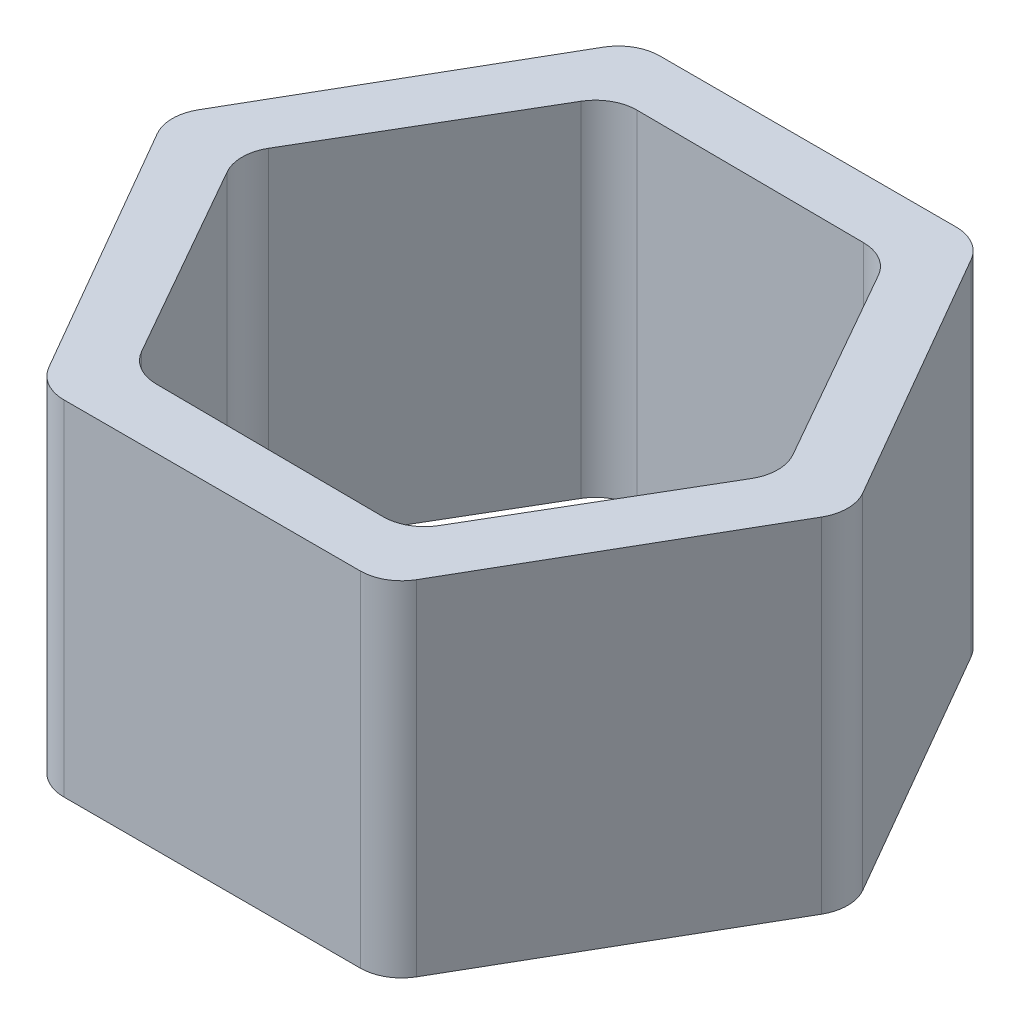
ISO-10303-21;
HEADER;
FILE_DESCRIPTION(('STEP AP214'),'2;1');
FILE_NAME('part.step','',(''),(''),'','','');
FILE_SCHEMA(('AUTOMOTIVE_DESIGN { 1 0 10303 214 1 1 1 1 }'));
ENDSEC;
DATA;
#1=APPLICATION_CONTEXT('core data for automotive mechanical design processes');
#2=APPLICATION_PROTOCOL_DEFINITION('international standard','automotive_design',2000,#1);
#3=PRODUCT_CONTEXT('',#1,'mechanical');
#4=PRODUCT('Part','Part','',(#3));
#5=PRODUCT_RELATED_PRODUCT_CATEGORY('part','',(#4));
#6=PRODUCT_DEFINITION_FORMATION('','',#4);
#7=PRODUCT_DEFINITION_CONTEXT('part definition',#1,'design');
#8=PRODUCT_DEFINITION('design','',#6,#7);
#9=PRODUCT_DEFINITION_SHAPE('','',#8);
#10=(LENGTH_UNIT() NAMED_UNIT(*) SI_UNIT(.MILLI.,.METRE.));
#11=(NAMED_UNIT(*) PLANE_ANGLE_UNIT() SI_UNIT($,.RADIAN.));
#12=(NAMED_UNIT(*) SI_UNIT($,.STERADIAN.) SOLID_ANGLE_UNIT());
#13=UNCERTAINTY_MEASURE_WITH_UNIT(LENGTH_MEASURE(1.E-05),#10,'distance_accuracy_value','');
#14=(GEOMETRIC_REPRESENTATION_CONTEXT(3) GLOBAL_UNCERTAINTY_ASSIGNED_CONTEXT((#13)) GLOBAL_UNIT_ASSIGNED_CONTEXT((#10,
#11,#12)) REPRESENTATION_CONTEXT('',''));
#15=CARTESIAN_POINT('',(0.,0.,0.));
#16=DIRECTION('',(0.,0.,1.));
#17=DIRECTION('',(1.,0.,0.));
#18=AXIS2_PLACEMENT_3D('',#15,#16,#17);
#19=CARTESIAN_POINT('',(-100.,100.,0.));
#20=DIRECTION('',(0.866025403784439,0.,-0.5));
#21=DIRECTION('',(-0.5,0.,-0.866025403784439));
#22=AXIS2_PLACEMENT_3D('',#19,#20,#21);
#23=PLANE('',#22);
#24=DIRECTION('',(0.5,0.,0.866025403784439));
#25=VECTOR('',#24,1.);
#26=CARTESIAN_POINT('',(-100.,100.,0.));
#27=LINE('',#26,#25);
#28=CARTESIAN_POINT('',(-96.5358983848623,100.,6.00000000000002));
#29=VERTEX_POINT('',#28);
#30=CARTESIAN_POINT('',(-53.4641016151378,100.,80.6025403784439));
#31=VERTEX_POINT('',#30);
#32=EDGE_CURVE('E220',#29,#31,#27,.T.);
#33=ORIENTED_EDGE('',*,*,#32,.F.);
#34=DIRECTION('',(0.,-1.,0.));
#35=VECTOR('',#34,1.);
#36=CARTESIAN_POINT('',(-96.5358983848623,100.,6.00000000000002));
#37=LINE('',#36,#35);
#38=CARTESIAN_POINT('',(-96.5358983848623,0.,6.00000000000002));
#39=VERTEX_POINT('',#38);
#40=EDGE_CURVE('E205',#29,#39,#37,.T.);
#41=ORIENTED_EDGE('',*,*,#40,.T.);
#42=DIRECTION('',(0.5,0.,0.866025403784439));
#43=VECTOR('',#42,1.);
#44=CARTESIAN_POINT('',(-100.,0.,0.));
#45=LINE('',#44,#43);
#46=CARTESIAN_POINT('',(-53.4641016151378,0.,80.6025403784439));
#47=VERTEX_POINT('',#46);
#48=EDGE_CURVE('E217',#39,#47,#45,.T.);
#49=ORIENTED_EDGE('',*,*,#48,.T.);
#50=DIRECTION('',(0.,-1.,0.));
#51=VECTOR('',#50,1.);
#52=CARTESIAN_POINT('',(-53.4641016151378,100.,80.6025403784439));
#53=LINE('',#52,#51);
#54=EDGE_CURVE('E222',#47,#31,#53,.F.);
#55=ORIENTED_EDGE('',*,*,#54,.T.);
#56=EDGE_LOOP('',(#33,#41,#49,#55));
#57=FACE_BOUND('',#56,.T.);
#58=ADVANCED_FACE('F39',(#57),#23,.F.);
#59=CARTESIAN_POINT('',(-50.,100.,86.6025403784439));
#60=DIRECTION('',(0.,0.,-1.));
#61=DIRECTION('',(-1.,0.,0.));
#62=AXIS2_PLACEMENT_3D('',#59,#60,#61);
#63=PLANE('',#62);
#64=DIRECTION('',(1.,0.,0.));
#65=VECTOR('',#64,1.);
#66=CARTESIAN_POINT('',(-50.,100.,86.6025403784439));
#67=LINE('',#66,#65);
#68=CARTESIAN_POINT('',(-43.0717967697245,100.,86.6025403784439));
#69=VERTEX_POINT('',#68);
#70=CARTESIAN_POINT('',(43.0717967697244,100.,86.6025403784439));
#71=VERTEX_POINT('',#70);
#72=EDGE_CURVE('E395',#69,#71,#67,.T.);
#73=ORIENTED_EDGE('',*,*,#72,.F.);
#74=DIRECTION('',(0.,-1.,0.));
#75=VECTOR('',#74,1.);
#76=CARTESIAN_POINT('',(-43.0717967697245,100.,86.6025403784439));
#77=LINE('',#76,#75);
#78=CARTESIAN_POINT('',(-43.0717967697245,0.,86.6025403784439));
#79=VERTEX_POINT('',#78);
#80=EDGE_CURVE('E275',#69,#79,#77,.T.);
#81=ORIENTED_EDGE('',*,*,#80,.T.);
#82=DIRECTION('',(1.,0.,0.));
#83=VECTOR('',#82,1.);
#84=CARTESIAN_POINT('',(-50.,0.,86.6025403784439));
#85=LINE('',#84,#83);
#86=CARTESIAN_POINT('',(43.0717967697244,0.,86.6025403784439));
#87=VERTEX_POINT('',#86);
#88=EDGE_CURVE('E226',#79,#87,#85,.T.);
#89=ORIENTED_EDGE('',*,*,#88,.T.);
#90=DIRECTION('',(0.,-1.,0.));
#91=VECTOR('',#90,1.);
#92=CARTESIAN_POINT('',(43.0717967697244,100.,86.6025403784439));
#93=LINE('',#92,#91);
#94=EDGE_CURVE('E273',#87,#71,#93,.F.);
#95=ORIENTED_EDGE('',*,*,#94,.T.);
#96=EDGE_LOOP('',(#73,#81,#89,#95));
#97=FACE_BOUND('',#96,.T.);
#98=ADVANCED_FACE('F443',(#97),#63,.F.);
#99=CARTESIAN_POINT('',(49.9999999999999,100.,86.6025403784439));
#100=DIRECTION('',(-0.866025403784439,0.,-0.5));
#101=DIRECTION('',(-0.5,0.,0.866025403784439));
#102=AXIS2_PLACEMENT_3D('',#99,#100,#101);
#103=PLANE('',#102);
#104=DIRECTION('',(0.5,0.,-0.866025403784439));
#105=VECTOR('',#104,1.);
#106=CARTESIAN_POINT('',(49.9999999999999,100.,86.6025403784439));
#107=LINE('',#106,#105);
#108=CARTESIAN_POINT('',(53.4641016151377,100.,80.6025403784439));
#109=VERTEX_POINT('',#108);
#110=CARTESIAN_POINT('',(96.5358983848622,100.,5.99999999999996));
#111=VERTEX_POINT('',#110);
#112=EDGE_CURVE('E398',#109,#111,#107,.T.);
#113=ORIENTED_EDGE('',*,*,#112,.F.);
#114=DIRECTION('',(0.,-1.,0.));
#115=VECTOR('',#114,1.);
#116=CARTESIAN_POINT('',(53.4641016151377,100.,80.6025403784439));
#117=LINE('',#116,#115);
#118=CARTESIAN_POINT('',(53.4641016151377,0.,80.6025403784439));
#119=VERTEX_POINT('',#118);
#120=EDGE_CURVE('E280',#109,#119,#117,.T.);
#121=ORIENTED_EDGE('',*,*,#120,.T.);
#122=DIRECTION('',(0.5,0.,-0.866025403784439));
#123=VECTOR('',#122,1.);
#124=CARTESIAN_POINT('',(49.9999999999999,0.,86.6025403784439));
#125=LINE('',#124,#123);
#126=CARTESIAN_POINT('',(96.5358983848622,0.,5.99999999999996));
#127=VERTEX_POINT('',#126);
#128=EDGE_CURVE('E230',#119,#127,#125,.T.);
#129=ORIENTED_EDGE('',*,*,#128,.T.);
#130=DIRECTION('',(0.,-1.,0.));
#131=VECTOR('',#130,1.);
#132=CARTESIAN_POINT('',(96.5358983848622,100.,5.99999999999996));
#133=LINE('',#132,#131);
#134=EDGE_CURVE('E278',#127,#111,#133,.F.);
#135=ORIENTED_EDGE('',*,*,#134,.T.);
#136=EDGE_LOOP('',(#113,#121,#129,#135));
#137=FACE_BOUND('',#136,.T.);
#138=ADVANCED_FACE('F435',(#137),#103,.F.);
#139=CARTESIAN_POINT('',(99.9999999999999,100.,0.));
#140=DIRECTION('',(-0.866025403784438,0.,0.5));
#141=DIRECTION('',(0.5,0.,0.866025403784439));
#142=AXIS2_PLACEMENT_3D('',#139,#140,#141);
#143=PLANE('',#142);
#144=DIRECTION('',(-0.5,0.,-0.866025403784438));
#145=VECTOR('',#144,1.);
#146=CARTESIAN_POINT('',(99.9999999999999,0.,0.));
#147=LINE('',#146,#145);
#148=CARTESIAN_POINT('',(96.5358983848622,0.,-6.00000000000004));
#149=VERTEX_POINT('',#148);
#150=CARTESIAN_POINT('',(53.4641016151377,0.,-80.6025403784439));
#151=VERTEX_POINT('',#150);
#152=EDGE_CURVE('E241',#149,#151,#147,.T.);
#153=ORIENTED_EDGE('',*,*,#152,.T.);
#154=DIRECTION('',(0.,-1.,0.));
#155=VECTOR('',#154,1.);
#156=CARTESIAN_POINT('',(53.4641016151377,100.,-80.6025403784439));
#157=LINE('',#156,#155);
#158=CARTESIAN_POINT('',(53.4641016151377,100.,-80.6025403784439));
#159=VERTEX_POINT('',#158);
#160=EDGE_CURVE('E291',#151,#159,#157,.F.);
#161=ORIENTED_EDGE('',*,*,#160,.T.);
#162=DIRECTION('',(-0.5,0.,-0.866025403784438));
#163=VECTOR('',#162,1.);
#164=CARTESIAN_POINT('',(99.9999999999999,100.,0.));
#165=LINE('',#164,#163);
#166=CARTESIAN_POINT('',(96.5358983848622,100.,-6.00000000000004));
#167=VERTEX_POINT('',#166);
#168=EDGE_CURVE('E401',#167,#159,#165,.T.);
#169=ORIENTED_EDGE('',*,*,#168,.F.);
#170=DIRECTION('',(0.,-1.,0.));
#171=VECTOR('',#170,1.);
#172=CARTESIAN_POINT('',(96.5358983848622,100.,-6.00000000000004));
#173=LINE('',#172,#171);
#174=EDGE_CURVE('E288',#167,#149,#173,.T.);
#175=ORIENTED_EDGE('',*,*,#174,.T.);
#176=EDGE_LOOP('',(#153,#161,#169,#175));
#177=FACE_BOUND('',#176,.T.);
#178=ADVANCED_FACE('F425',(#177),#143,.F.);
#179=CARTESIAN_POINT('',(49.9999999999999,100.,-86.6025403784439));
#180=DIRECTION('',(0.,0.,1.));
#181=DIRECTION('',(1.,0.,0.));
#182=AXIS2_PLACEMENT_3D('',#179,#180,#181);
#183=PLANE('',#182);
#184=DIRECTION('',(-1.,0.,0.));
#185=VECTOR('',#184,1.);
#186=CARTESIAN_POINT('',(49.9999999999999,100.,-86.6025403784439));
#187=LINE('',#186,#185);
#188=CARTESIAN_POINT('',(43.0717967697244,100.,-86.6025403784439));
#189=VERTEX_POINT('',#188);
#190=CARTESIAN_POINT('',(-43.0717967697245,100.,-86.6025403784439));
#191=VERTEX_POINT('',#190);
#192=EDGE_CURVE('E403',#189,#191,#187,.T.);
#193=ORIENTED_EDGE('',*,*,#192,.F.);
#194=DIRECTION('',(0.,-1.,0.));
#195=VECTOR('',#194,1.);
#196=CARTESIAN_POINT('',(43.0717967697244,100.,-86.6025403784439));
#197=LINE('',#196,#195);
#198=CARTESIAN_POINT('',(43.0717967697244,0.,-86.6025403784439));
#199=VERTEX_POINT('',#198);
#200=EDGE_CURVE('E285',#189,#199,#197,.T.);
#201=ORIENTED_EDGE('',*,*,#200,.T.);
#202=DIRECTION('',(-1.,0.,0.));
#203=VECTOR('',#202,1.);
#204=CARTESIAN_POINT('',(49.9999999999999,0.,-86.6025403784439));
#205=LINE('',#204,#203);
#206=CARTESIAN_POINT('',(-43.0717967697245,0.,-86.6025403784439));
#207=VERTEX_POINT('',#206);
#208=EDGE_CURVE('E244',#199,#207,#205,.T.);
#209=ORIENTED_EDGE('',*,*,#208,.T.);
#210=DIRECTION('',(0.,-1.,0.));
#211=VECTOR('',#210,1.);
#212=CARTESIAN_POINT('',(-43.0717967697245,100.,-86.6025403784439));
#213=LINE('',#212,#211);
#214=EDGE_CURVE('E283',#207,#191,#213,.F.);
#215=ORIENTED_EDGE('',*,*,#214,.T.);
#216=EDGE_LOOP('',(#193,#201,#209,#215));
#217=FACE_BOUND('',#216,.T.);
#218=ADVANCED_FACE('F417',(#217),#183,.F.);
#219=CARTESIAN_POINT('',(-50.,100.,-86.6025403784439));
#220=DIRECTION('',(0.866025403784439,0.,0.5));
#221=DIRECTION('',(0.5,0.,-0.866025403784439));
#222=AXIS2_PLACEMENT_3D('',#219,#220,#221);
#223=PLANE('',#222);
#224=DIRECTION('',(-0.5,0.,0.866025403784439));
#225=VECTOR('',#224,1.);
#226=CARTESIAN_POINT('',(-50.,0.,-86.6025403784439));
#227=LINE('',#226,#225);
#228=CARTESIAN_POINT('',(-53.4641016151377,0.,-80.6025403784439));
#229=VERTEX_POINT('',#228);
#230=CARTESIAN_POINT('',(-96.5358983848623,0.,-5.99999999999998));
#231=VERTEX_POINT('',#230);
#232=EDGE_CURVE('E247',#229,#231,#227,.T.);
#233=ORIENTED_EDGE('',*,*,#232,.T.);
#234=DIRECTION('',(0.,-1.,0.));
#235=VECTOR('',#234,1.);
#236=CARTESIAN_POINT('',(-96.5358983848623,100.,-5.99999999999998));
#237=LINE('',#236,#235);
#238=CARTESIAN_POINT('',(-96.5358983848623,100.,-5.99999999999998));
#239=VERTEX_POINT('',#238);
#240=EDGE_CURVE('E206',#231,#239,#237,.F.);
#241=ORIENTED_EDGE('',*,*,#240,.T.);
#242=DIRECTION('',(-0.5,0.,0.866025403784439));
#243=VECTOR('',#242,1.);
#244=CARTESIAN_POINT('',(-50.,100.,-86.6025403784439));
#245=LINE('',#244,#243);
#246=CARTESIAN_POINT('',(-53.4641016151377,100.,-80.6025403784439));
#247=VERTEX_POINT('',#246);
#248=EDGE_CURVE('E236',#247,#239,#245,.T.);
#249=ORIENTED_EDGE('',*,*,#248,.F.);
#250=DIRECTION('',(0.,-1.,0.));
#251=VECTOR('',#250,1.);
#252=CARTESIAN_POINT('',(-53.4641016151377,100.,-80.6025403784439));
#253=LINE('',#252,#251);
#254=EDGE_CURVE('E211',#247,#229,#253,.T.);
#255=ORIENTED_EDGE('',*,*,#254,.T.);
#256=EDGE_LOOP('',(#233,#241,#249,#255));
#257=FACE_BOUND('',#256,.T.);
#258=ADVANCED_FACE('F411',(#257),#223,.F.);
#259=CARTESIAN_POINT('',(0.,100.,0.));
#260=DIRECTION('',(0.,1.,0.));
#261=DIRECTION('',(0.,0.,1.));
#262=AXIS2_PLACEMENT_3D('',#259,#260,#261);
#263=PLANE('',#262);
#264=DIRECTION('',(0.999977587037545,0.,0.00669517905430469));
#265=VECTOR('',#264,1.);
#266=CARTESIAN_POINT('',(-40.543134883871,100.,69.1494182700949));
#267=LINE('',#266,#265);
#268=CARTESIAN_POINT('',(-33.6150869351543,100.,69.1958038312462));
#269=VERTEX_POINT('',#268);
#270=CARTESIAN_POINT('',(32.6855374881659,100.,69.6397083323875));
#271=VERTEX_POINT('',#270);
#272=EDGE_CURVE('E384',#269,#271,#267,.T.);
#273=ORIENTED_EDGE('',*,*,#272,.F.);
#274=CARTESIAN_POINT('',(-33.5347447865027,100.,57.1960727867957));
#275=DIRECTION('',(0.,1.,0.));
#276=DIRECTION('',(0.,0.,1.));
#277=AXIS2_PLACEMENT_3D('',#274,#275,#276);
#278=CIRCLE('',#277,12.);
#279=CARTESIAN_POINT('',(-43.9669877839034,100.,63.126359967294));
#280=VERTEX_POINT('',#279);
#281=EDGE_CURVE('E322',#269,#280,#278,.F.);
#282=ORIENTED_EDGE('',*,*,#281,.T.);
#283=DIRECTION('',(0.494190598374859,0.,0.869353583116731));
#284=VECTOR('',#283,1.);
#285=CARTESIAN_POINT('',(-80.1567203207535,100.,-0.536675623443852));
#286=LINE('',#285,#284);
#287=CARTESIAN_POINT('',(-76.732867420721,100.,5.48638267935709));
#288=VERTEX_POINT('',#287);
#289=EDGE_CURVE('E348',#288,#280,#286,.T.);
#290=ORIENTED_EDGE('',*,*,#289,.F.);
#291=CARTESIAN_POINT('',(-66.3006244233202,100.,-0.443904501141229));
#292=DIRECTION('',(0.,1.,0.));
#293=DIRECTION('',(0.,0.,1.));
#294=AXIS2_PLACEMENT_3D('',#291,#292,#293);
#295=CIRCLE('',#294,12.);
#296=CARTESIAN_POINT('',(-76.6525252720693,100.,-6.51334836509346));
#297=VERTEX_POINT('',#296);
#298=EDGE_CURVE('E47',#288,#297,#295,.F.);
#299=ORIENTED_EDGE('',*,*,#298,.T.);
#300=DIRECTION('',(-0.505786988662686,0.,0.862658404062426));
#301=VECTOR('',#300,1.);
#302=CARTESIAN_POINT('',(-39.6135854368825,100.,-69.6860938935388));
#303=LINE('',#302,#301);
#304=CARTESIAN_POINT('',(-43.1177804855666,100.,-63.7094211518891));
#305=VERTEX_POINT('',#304);
#306=EDGE_CURVE('E346',#305,#297,#303,.T.);
#307=ORIENTED_EDGE('',*,*,#306,.F.);
#308=CARTESIAN_POINT('',(-32.7658796368175,100.,-57.6399772879369));
#309=DIRECTION('',(0.,1.,0.));
#310=DIRECTION('',(0.,0.,1.));
#311=AXIS2_PLACEMENT_3D('',#308,#309,#310);
#312=CIRCLE('',#311,12.);
#313=CARTESIAN_POINT('',(-32.6855374881659,100.,-69.6397083323874));
#314=VERTEX_POINT('',#313);
#315=EDGE_CURVE('E338',#305,#314,#312,.F.);
#316=ORIENTED_EDGE('',*,*,#315,.T.);
#317=DIRECTION('',(-0.999977587037545,0.,-0.00669517905430434));
#318=VECTOR('',#317,1.);
#319=CARTESIAN_POINT('',(40.5431348838709,100.,-69.1494182700949));
#320=LINE('',#319,#318);
#321=CARTESIAN_POINT('',(33.6150869351543,100.,-69.1958038312462));
#322=VERTEX_POINT('',#321);
#323=EDGE_CURVE('E353',#322,#314,#320,.T.);
#324=ORIENTED_EDGE('',*,*,#323,.F.);
#325=CARTESIAN_POINT('',(33.5347447865027,100.,-57.1960727867957));
#326=DIRECTION('',(0.,1.,0.));
#327=DIRECTION('',(0.,0.,1.));
#328=AXIS2_PLACEMENT_3D('',#325,#326,#327);
#329=CIRCLE('',#328,12.);
#330=CARTESIAN_POINT('',(43.9669877839034,100.,-63.126359967294));
#331=VERTEX_POINT('',#330);
#332=EDGE_CURVE('E334',#322,#331,#329,.F.);
#333=ORIENTED_EDGE('',*,*,#332,.T.);
#334=DIRECTION('',(-0.494190598374859,0.,-0.869353583116731));
#335=VECTOR('',#334,1.);
#336=CARTESIAN_POINT('',(80.1567203207535,100.,0.536675623443834));
#337=LINE('',#336,#335);
#338=CARTESIAN_POINT('',(76.732867420721,100.,-5.48638267935709));
#339=VERTEX_POINT('',#338);
#340=EDGE_CURVE('E389',#339,#331,#337,.T.);
#341=ORIENTED_EDGE('',*,*,#340,.F.);
#342=CARTESIAN_POINT('',(66.3006244233202,100.,0.443904501141227));
#343=DIRECTION('',(0.,1.,0.));
#344=DIRECTION('',(0.,0.,1.));
#345=AXIS2_PLACEMENT_3D('',#342,#343,#344);
#346=CIRCLE('',#345,12.);
#347=CARTESIAN_POINT('',(76.6525252720693,100.,6.51334836509346));
#348=VERTEX_POINT('',#347);
#349=EDGE_CURVE('E330',#339,#348,#346,.F.);
#350=ORIENTED_EDGE('',*,*,#349,.T.);
#351=DIRECTION('',(0.505786988662685,0.,-0.862658404062426));
#352=VECTOR('',#351,1.);
#353=CARTESIAN_POINT('',(39.6135854368825,100.,69.6860938935388));
#354=LINE('',#353,#352);
#355=CARTESIAN_POINT('',(43.1177804855666,100.,63.7094211518892));
#356=VERTEX_POINT('',#355);
#357=EDGE_CURVE('E386',#356,#348,#354,.T.);
#358=ORIENTED_EDGE('',*,*,#357,.F.);
#359=CARTESIAN_POINT('',(32.7658796368175,100.,57.6399772879369));
#360=DIRECTION('',(0.,1.,0.));
#361=DIRECTION('',(0.,0.,1.));
#362=AXIS2_PLACEMENT_3D('',#359,#360,#361);
#363=CIRCLE('',#362,12.);
#364=EDGE_CURVE('E326',#356,#271,#363,.F.);
#365=ORIENTED_EDGE('',*,*,#364,.T.);
#366=EDGE_LOOP('',(#273,#282,#290,#299,#307,#316,#324,#333,#341,#350,#358,#365));
#367=FACE_BOUND('',#366,.T.);
#368=ORIENTED_EDGE('',*,*,#248,.T.);
#369=CARTESIAN_POINT('',(-86.143593539449,100.,0.));
#370=DIRECTION('',(0.,1.,0.));
#371=DIRECTION('',(0.,0.,1.));
#372=AXIS2_PLACEMENT_3D('',#369,#370,#371);
#373=CIRCLE('',#372,12.);
#374=EDGE_CURVE('E271',#239,#29,#373,.T.);
#375=ORIENTED_EDGE('',*,*,#374,.T.);
#376=ORIENTED_EDGE('',*,*,#32,.T.);
#377=CARTESIAN_POINT('',(-43.0717967697245,100.,74.6025403784439));
#378=DIRECTION('',(0.,1.,0.));
#379=DIRECTION('',(0.,0.,1.));
#380=AXIS2_PLACEMENT_3D('',#377,#378,#379);
#381=CIRCLE('',#380,12.);
#382=EDGE_CURVE('E269',#31,#69,#381,.T.);
#383=ORIENTED_EDGE('',*,*,#382,.T.);
#384=ORIENTED_EDGE('',*,*,#72,.T.);
#385=CARTESIAN_POINT('',(43.0717967697244,100.,74.6025403784439));
#386=DIRECTION('',(0.,1.,0.));
#387=DIRECTION('',(0.,0.,1.));
#388=AXIS2_PLACEMENT_3D('',#385,#386,#387);
#389=CIRCLE('',#388,12.);
#390=EDGE_CURVE('E267',#71,#109,#389,.T.);
#391=ORIENTED_EDGE('',*,*,#390,.T.);
#392=ORIENTED_EDGE('',*,*,#112,.T.);
#393=CARTESIAN_POINT('',(86.1435935394489,100.,0.));
#394=DIRECTION('',(0.,1.,0.));
#395=DIRECTION('',(0.,0.,1.));
#396=AXIS2_PLACEMENT_3D('',#393,#394,#395);
#397=CIRCLE('',#396,12.);
#398=EDGE_CURVE('E263',#111,#167,#397,.T.);
#399=ORIENTED_EDGE('',*,*,#398,.T.);
#400=ORIENTED_EDGE('',*,*,#168,.T.);
#401=CARTESIAN_POINT('',(43.0717967697244,100.,-74.6025403784439));
#402=DIRECTION('',(0.,1.,0.));
#403=DIRECTION('',(0.,0.,1.));
#404=AXIS2_PLACEMENT_3D('',#401,#402,#403);
#405=CIRCLE('',#404,12.);
#406=EDGE_CURVE('E265',#159,#189,#405,.T.);
#407=ORIENTED_EDGE('',*,*,#406,.T.);
#408=ORIENTED_EDGE('',*,*,#192,.T.);
#409=CARTESIAN_POINT('',(-43.0717967697245,100.,-74.6025403784439));
#410=DIRECTION('',(0.,1.,0.));
#411=DIRECTION('',(0.,0.,1.));
#412=AXIS2_PLACEMENT_3D('',#409,#410,#411);
#413=CIRCLE('',#412,12.);
#414=EDGE_CURVE('E261',#191,#247,#413,.T.);
#415=ORIENTED_EDGE('',*,*,#414,.T.);
#416=EDGE_LOOP('',(#368,#375,#376,#383,#384,#391,#392,#399,#400,#407,#408,#415));
#417=FACE_BOUND('',#416,.T.);
#418=ADVANCED_FACE('F344',(#367,#417),#263,.T.);
#419=CARTESIAN_POINT('',(0.,0.,0.));
#420=DIRECTION('',(0.,1.,0.));
#421=DIRECTION('',(0.,0.,1.));
#422=AXIS2_PLACEMENT_3D('',#419,#420,#421);
#423=PLANE('',#422);
#424=DIRECTION('',(-0.505786988662686,0.,0.862658404062426));
#425=VECTOR('',#424,1.);
#426=CARTESIAN_POINT('',(-39.6135854368825,0.,-69.6860938935388));
#427=LINE('',#426,#425);
#428=CARTESIAN_POINT('',(-43.1177804855666,0.,-63.7094211518891));
#429=VERTEX_POINT('',#428);
#430=CARTESIAN_POINT('',(-76.6525252720693,0.,-6.51334836509346));
#431=VERTEX_POINT('',#430);
#432=EDGE_CURVE('E233',#429,#431,#427,.T.);
#433=ORIENTED_EDGE('',*,*,#432,.T.);
#434=CARTESIAN_POINT('',(-66.3006244233202,0.,-0.443904501141229));
#435=DIRECTION('',(0.,1.,0.));
#436=DIRECTION('',(0.,0.,1.));
#437=AXIS2_PLACEMENT_3D('',#434,#435,#436);
#438=CIRCLE('',#437,12.);
#439=CARTESIAN_POINT('',(-76.732867420721,0.,5.48638267935709));
#440=VERTEX_POINT('',#439);
#441=EDGE_CURVE('E11',#431,#440,#438,.T.);
#442=ORIENTED_EDGE('',*,*,#441,.T.);
#443=DIRECTION('',(0.494190598374859,0.,0.869353583116731));
#444=VECTOR('',#443,1.);
#445=CARTESIAN_POINT('',(-80.1567203207535,0.,-0.536675623443852));
#446=LINE('',#445,#444);
#447=CARTESIAN_POINT('',(-43.9669877839034,0.,63.126359967294));
#448=VERTEX_POINT('',#447);
#449=EDGE_CURVE('E227',#440,#448,#446,.T.);
#450=ORIENTED_EDGE('',*,*,#449,.T.);
#451=CARTESIAN_POINT('',(-33.5347447865027,0.,57.1960727867957));
#452=DIRECTION('',(0.,1.,0.));
#453=DIRECTION('',(0.,0.,1.));
#454=AXIS2_PLACEMENT_3D('',#451,#452,#453);
#455=CIRCLE('',#454,12.);
#456=CARTESIAN_POINT('',(-33.6150869351543,0.,69.1958038312462));
#457=VERTEX_POINT('',#456);
#458=EDGE_CURVE('E324',#448,#457,#455,.T.);
#459=ORIENTED_EDGE('',*,*,#458,.T.);
#460=DIRECTION('',(0.999977587037545,0.,0.00669517905430469));
#461=VECTOR('',#460,1.);
#462=CARTESIAN_POINT('',(-40.543134883871,0.,69.1494182700949));
#463=LINE('',#462,#461);
#464=CARTESIAN_POINT('',(32.6855374881659,0.,69.6397083323875));
#465=VERTEX_POINT('',#464);
#466=EDGE_CURVE('E366',#457,#465,#463,.T.);
#467=ORIENTED_EDGE('',*,*,#466,.T.);
#468=CARTESIAN_POINT('',(32.7658796368175,0.,57.6399772879369));
#469=DIRECTION('',(0.,1.,0.));
#470=DIRECTION('',(0.,0.,1.));
#471=AXIS2_PLACEMENT_3D('',#468,#469,#470);
#472=CIRCLE('',#471,12.);
#473=CARTESIAN_POINT('',(43.1177804855666,0.,63.7094211518892));
#474=VERTEX_POINT('',#473);
#475=EDGE_CURVE('E328',#465,#474,#472,.T.);
#476=ORIENTED_EDGE('',*,*,#475,.T.);
#477=DIRECTION('',(0.505786988662685,0.,-0.862658404062426));
#478=VECTOR('',#477,1.);
#479=CARTESIAN_POINT('',(39.6135854368825,0.,69.6860938935388));
#480=LINE('',#479,#478);
#481=CARTESIAN_POINT('',(76.6525252720693,0.,6.51334836509346));
#482=VERTEX_POINT('',#481);
#483=EDGE_CURVE('E372',#474,#482,#480,.T.);
#484=ORIENTED_EDGE('',*,*,#483,.T.);
#485=CARTESIAN_POINT('',(66.3006244233202,0.,0.443904501141227));
#486=DIRECTION('',(0.,1.,0.));
#487=DIRECTION('',(0.,0.,1.));
#488=AXIS2_PLACEMENT_3D('',#485,#486,#487);
#489=CIRCLE('',#488,12.);
#490=CARTESIAN_POINT('',(76.732867420721,0.,-5.48638267935709));
#491=VERTEX_POINT('',#490);
#492=EDGE_CURVE('E332',#482,#491,#489,.T.);
#493=ORIENTED_EDGE('',*,*,#492,.T.);
#494=DIRECTION('',(-0.494190598374859,0.,-0.869353583116731));
#495=VECTOR('',#494,1.);
#496=CARTESIAN_POINT('',(80.1567203207535,0.,0.536675623443834));
#497=LINE('',#496,#495);
#498=CARTESIAN_POINT('',(43.9669877839034,0.,-63.126359967294));
#499=VERTEX_POINT('',#498);
#500=EDGE_CURVE('E375',#491,#499,#497,.T.);
#501=ORIENTED_EDGE('',*,*,#500,.T.);
#502=CARTESIAN_POINT('',(33.5347447865027,0.,-57.1960727867957));
#503=DIRECTION('',(0.,1.,0.));
#504=DIRECTION('',(0.,0.,1.));
#505=AXIS2_PLACEMENT_3D('',#502,#503,#504);
#506=CIRCLE('',#505,12.);
#507=CARTESIAN_POINT('',(33.6150869351543,0.,-69.1958038312462));
#508=VERTEX_POINT('',#507);
#509=EDGE_CURVE('E336',#499,#508,#506,.T.);
#510=ORIENTED_EDGE('',*,*,#509,.T.);
#511=DIRECTION('',(-0.999977587037545,0.,-0.00669517905430434));
#512=VECTOR('',#511,1.);
#513=CARTESIAN_POINT('',(40.5431348838709,0.,-69.1494182700949));
#514=LINE('',#513,#512);
#515=CARTESIAN_POINT('',(-32.6855374881659,0.,-69.6397083323874));
#516=VERTEX_POINT('',#515);
#517=EDGE_CURVE('E381',#508,#516,#514,.T.);
#518=ORIENTED_EDGE('',*,*,#517,.T.);
#519=CARTESIAN_POINT('',(-32.7658796368175,0.,-57.6399772879369));
#520=DIRECTION('',(0.,1.,0.));
#521=DIRECTION('',(0.,0.,1.));
#522=AXIS2_PLACEMENT_3D('',#519,#520,#521);
#523=CIRCLE('',#522,12.);
#524=EDGE_CURVE('E61',#516,#429,#523,.T.);
#525=ORIENTED_EDGE('',*,*,#524,.T.);
#526=EDGE_LOOP('',(#433,#442,#450,#459,#467,#476,#484,#493,#501,#510,#518,#525));
#527=FACE_BOUND('',#526,.T.);
#528=ORIENTED_EDGE('',*,*,#48,.F.);
#529=CARTESIAN_POINT('',(-86.143593539449,0.,0.));
#530=DIRECTION('',(0.,1.,0.));
#531=DIRECTION('',(0.,0.,1.));
#532=AXIS2_PLACEMENT_3D('',#529,#530,#531);
#533=CIRCLE('',#532,12.);
#534=EDGE_CURVE('E201',#39,#231,#533,.F.);
#535=ORIENTED_EDGE('',*,*,#534,.T.);
#536=ORIENTED_EDGE('',*,*,#232,.F.);
#537=CARTESIAN_POINT('',(-43.0717967697245,0.,-74.6025403784439));
#538=DIRECTION('',(0.,1.,0.));
#539=DIRECTION('',(0.,0.,1.));
#540=AXIS2_PLACEMENT_3D('',#537,#538,#539);
#541=CIRCLE('',#540,12.);
#542=EDGE_CURVE('E221',#229,#207,#541,.F.);
#543=ORIENTED_EDGE('',*,*,#542,.T.);
#544=ORIENTED_EDGE('',*,*,#208,.F.);
#545=CARTESIAN_POINT('',(43.0717967697244,0.,-74.6025403784439));
#546=DIRECTION('',(0.,1.,0.));
#547=DIRECTION('',(0.,0.,1.));
#548=AXIS2_PLACEMENT_3D('',#545,#546,#547);
#549=CIRCLE('',#548,12.);
#550=EDGE_CURVE('E253',#199,#151,#549,.F.);
#551=ORIENTED_EDGE('',*,*,#550,.T.);
#552=ORIENTED_EDGE('',*,*,#152,.F.);
#553=CARTESIAN_POINT('',(86.1435935394489,0.,0.));
#554=DIRECTION('',(0.,1.,0.));
#555=DIRECTION('',(0.,0.,1.));
#556=AXIS2_PLACEMENT_3D('',#553,#554,#555);
#557=CIRCLE('',#556,12.);
#558=EDGE_CURVE('E251',#149,#127,#557,.F.);
#559=ORIENTED_EDGE('',*,*,#558,.T.);
#560=ORIENTED_EDGE('',*,*,#128,.F.);
#561=CARTESIAN_POINT('',(43.0717967697244,0.,74.6025403784439));
#562=DIRECTION('',(0.,1.,0.));
#563=DIRECTION('',(0.,0.,1.));
#564=AXIS2_PLACEMENT_3D('',#561,#562,#563);
#565=CIRCLE('',#564,12.);
#566=EDGE_CURVE('E255',#119,#87,#565,.F.);
#567=ORIENTED_EDGE('',*,*,#566,.T.);
#568=ORIENTED_EDGE('',*,*,#88,.F.);
#569=CARTESIAN_POINT('',(-43.0717967697245,0.,74.6025403784439));
#570=DIRECTION('',(0.,1.,0.));
#571=DIRECTION('',(0.,0.,1.));
#572=AXIS2_PLACEMENT_3D('',#569,#570,#571);
#573=CIRCLE('',#572,12.);
#574=EDGE_CURVE('E212',#79,#47,#573,.F.);
#575=ORIENTED_EDGE('',*,*,#574,.T.);
#576=EDGE_LOOP('',(#528,#535,#536,#543,#544,#551,#552,#559,#560,#567,#568,#575));
#577=FACE_BOUND('',#576,.T.);
#578=ADVANCED_FACE('F224',(#527,#577),#423,.F.);
#579=CARTESIAN_POINT('',(-40.543134883871,0.,69.1494182700949));
#580=DIRECTION('',(-0.00669517905430469,0.,0.999977587037545));
#581=DIRECTION('',(0.999977587037545,0.,0.00669517905430469));
#582=AXIS2_PLACEMENT_3D('',#579,#580,#581);
#583=PLANE('',#582);
#584=ORIENTED_EDGE('',*,*,#466,.F.);
#585=DIRECTION('',(0.,1.,0.));
#586=VECTOR('',#585,1.);
#587=CARTESIAN_POINT('',(-33.6150869351543,100.,69.1958038312462));
#588=LINE('',#587,#586);
#589=EDGE_CURVE('E295',#457,#269,#588,.T.);
#590=ORIENTED_EDGE('',*,*,#589,.T.);
#591=ORIENTED_EDGE('',*,*,#272,.T.);
#592=DIRECTION('',(0.,1.,0.));
#593=VECTOR('',#592,1.);
#594=CARTESIAN_POINT('',(32.6855374881659,0.,69.6397083323875));
#595=LINE('',#594,#593);
#596=EDGE_CURVE('E293',#271,#465,#595,.F.);
#597=ORIENTED_EDGE('',*,*,#596,.T.);
#598=EDGE_LOOP('',(#584,#590,#591,#597));
#599=FACE_BOUND('',#598,.T.);
#600=ADVANCED_FACE('F369',(#599),#583,.F.);
#601=CARTESIAN_POINT('',(-80.1567203207535,0.,-0.536675623443852));
#602=DIRECTION('',(-0.869353583116731,0.,0.494190598374859));
#603=DIRECTION('',(0.494190598374859,0.,0.869353583116731));
#604=AXIS2_PLACEMENT_3D('',#601,#602,#603);
#605=PLANE('',#604);
#606=ORIENTED_EDGE('',*,*,#289,.T.);
#607=DIRECTION('',(0.,1.,0.));
#608=VECTOR('',#607,1.);
#609=CARTESIAN_POINT('',(-43.9669877839034,0.,63.126359967294));
#610=LINE('',#609,#608);
#611=EDGE_CURVE('E301',#280,#448,#610,.F.);
#612=ORIENTED_EDGE('',*,*,#611,.T.);
#613=ORIENTED_EDGE('',*,*,#449,.F.);
#614=DIRECTION('',(0.,1.,0.));
#615=VECTOR('',#614,1.);
#616=CARTESIAN_POINT('',(-76.732867420721,100.,5.48638267935709));
#617=LINE('',#616,#615);
#618=EDGE_CURVE('E298',#440,#288,#617,.T.);
#619=ORIENTED_EDGE('',*,*,#618,.T.);
#620=EDGE_LOOP('',(#606,#612,#613,#619));
#621=FACE_BOUND('',#620,.T.);
#622=ADVANCED_FACE('F359',(#621),#605,.F.);
#623=CARTESIAN_POINT('',(-39.6135854368825,0.,-69.6860938935388));
#624=DIRECTION('',(-0.862658404062426,0.,-0.505786988662686));
#625=DIRECTION('',(-0.505786988662686,0.,0.862658404062426));
#626=AXIS2_PLACEMENT_3D('',#623,#624,#625);
#627=PLANE('',#626);
#628=ORIENTED_EDGE('',*,*,#432,.F.);
#629=DIRECTION('',(0.,1.,0.));
#630=VECTOR('',#629,1.);
#631=CARTESIAN_POINT('',(-43.1177804855666,100.,-63.7094211518891));
#632=LINE('',#631,#630);
#633=EDGE_CURVE('E319',#429,#305,#632,.T.);
#634=ORIENTED_EDGE('',*,*,#633,.T.);
#635=ORIENTED_EDGE('',*,*,#306,.T.);
#636=DIRECTION('',(0.,1.,0.));
#637=VECTOR('',#636,1.);
#638=CARTESIAN_POINT('',(-76.6525252720693,0.,-6.51334836509346));
#639=LINE('',#638,#637);
#640=EDGE_CURVE('E54',#297,#431,#639,.F.);
#641=ORIENTED_EDGE('',*,*,#640,.T.);
#642=EDGE_LOOP('',(#628,#634,#635,#641));
#643=FACE_BOUND('',#642,.T.);
#644=ADVANCED_FACE('F351',(#643),#627,.F.);
#645=CARTESIAN_POINT('',(40.5431348838709,0.,-69.1494182700949));
#646=DIRECTION('',(0.00669517905430434,0.,-0.999977587037545));
#647=DIRECTION('',(-0.999977587037545,0.,-0.00669517905430434));
#648=AXIS2_PLACEMENT_3D('',#645,#646,#647);
#649=PLANE('',#648);
#650=ORIENTED_EDGE('',*,*,#517,.F.);
#651=DIRECTION('',(0.,1.,0.));
#652=VECTOR('',#651,1.);
#653=CARTESIAN_POINT('',(33.6150869351543,100.,-69.1958038312462));
#654=LINE('',#653,#652);
#655=EDGE_CURVE('E315',#508,#322,#654,.T.);
#656=ORIENTED_EDGE('',*,*,#655,.T.);
#657=ORIENTED_EDGE('',*,*,#323,.T.);
#658=DIRECTION('',(0.,1.,0.));
#659=VECTOR('',#658,1.);
#660=CARTESIAN_POINT('',(-32.6855374881659,0.,-69.6397083323874));
#661=LINE('',#660,#659);
#662=EDGE_CURVE('E313',#314,#516,#661,.F.);
#663=ORIENTED_EDGE('',*,*,#662,.T.);
#664=EDGE_LOOP('',(#650,#656,#657,#663));
#665=FACE_BOUND('',#664,.T.);
#666=ADVANCED_FACE('F484',(#665),#649,.F.);
#667=CARTESIAN_POINT('',(80.1567203207535,0.,0.536675623443834));
#668=DIRECTION('',(0.869353583116731,0.,-0.49419059837486));
#669=DIRECTION('',(-0.49419059837486,0.,-0.869353583116731));
#670=AXIS2_PLACEMENT_3D('',#667,#668,#669);
#671=PLANE('',#670);
#672=ORIENTED_EDGE('',*,*,#500,.F.);
#673=DIRECTION('',(0.,1.,0.));
#674=VECTOR('',#673,1.);
#675=CARTESIAN_POINT('',(76.732867420721,100.,-5.48638267935709));
#676=LINE('',#675,#674);
#677=EDGE_CURVE('E310',#491,#339,#676,.T.);
#678=ORIENTED_EDGE('',*,*,#677,.T.);
#679=ORIENTED_EDGE('',*,*,#340,.T.);
#680=DIRECTION('',(0.,1.,0.));
#681=VECTOR('',#680,1.);
#682=CARTESIAN_POINT('',(43.9669877839034,0.,-63.126359967294));
#683=LINE('',#682,#681);
#684=EDGE_CURVE('E308',#331,#499,#683,.F.);
#685=ORIENTED_EDGE('',*,*,#684,.T.);
#686=EDGE_LOOP('',(#672,#678,#679,#685));
#687=FACE_BOUND('',#686,.T.);
#688=ADVANCED_FACE('F480',(#687),#671,.F.);
#689=CARTESIAN_POINT('',(39.6135854368825,0.,69.6860938935388));
#690=DIRECTION('',(0.862658404062426,0.,0.505786988662685));
#691=DIRECTION('',(0.505786988662685,0.,-0.862658404062427));
#692=AXIS2_PLACEMENT_3D('',#689,#690,#691);
#693=PLANE('',#692);
#694=ORIENTED_EDGE('',*,*,#483,.F.);
#695=DIRECTION('',(0.,1.,0.));
#696=VECTOR('',#695,1.);
#697=CARTESIAN_POINT('',(43.1177804855666,100.,63.7094211518892));
#698=LINE('',#697,#696);
#699=EDGE_CURVE('E305',#474,#356,#698,.T.);
#700=ORIENTED_EDGE('',*,*,#699,.T.);
#701=ORIENTED_EDGE('',*,*,#357,.T.);
#702=DIRECTION('',(0.,1.,0.));
#703=VECTOR('',#702,1.);
#704=CARTESIAN_POINT('',(76.6525252720693,0.,6.51334836509345));
#705=LINE('',#704,#703);
#706=EDGE_CURVE('E303',#348,#482,#705,.F.);
#707=ORIENTED_EDGE('',*,*,#706,.T.);
#708=EDGE_LOOP('',(#694,#700,#701,#707));
#709=FACE_BOUND('',#708,.T.);
#710=ADVANCED_FACE('F455',(#709),#693,.F.);
#711=CARTESIAN_POINT('',(-86.143593539449,100.,0.));
#712=DIRECTION('',(0.,-1.,0.));
#713=DIRECTION('',(0.,0.,-1.));
#714=AXIS2_PLACEMENT_3D('',#711,#712,#713);
#715=CYLINDRICAL_SURFACE('',#714,12.);
#716=ORIENTED_EDGE('',*,*,#374,.F.);
#717=ORIENTED_EDGE('',*,*,#240,.F.);
#718=ORIENTED_EDGE('',*,*,#534,.F.);
#719=ORIENTED_EDGE('',*,*,#40,.F.);
#720=EDGE_LOOP('',(#716,#717,#718,#719));
#721=FACE_BOUND('',#720,.T.);
#722=ADVANCED_FACE('F204',(#721),#715,.T.);
#723=CARTESIAN_POINT('',(-43.0717967697245,100.,74.6025403784439));
#724=DIRECTION('',(0.,-1.,0.));
#725=DIRECTION('',(0.,0.,-1.));
#726=AXIS2_PLACEMENT_3D('',#723,#724,#725);
#727=CYLINDRICAL_SURFACE('',#726,12.);
#728=ORIENTED_EDGE('',*,*,#382,.F.);
#729=ORIENTED_EDGE('',*,*,#54,.F.);
#730=ORIENTED_EDGE('',*,*,#574,.F.);
#731=ORIENTED_EDGE('',*,*,#80,.F.);
#732=EDGE_LOOP('',(#728,#729,#730,#731));
#733=FACE_BOUND('',#732,.T.);
#734=ADVANCED_FACE('F447',(#733),#727,.T.);
#735=CARTESIAN_POINT('',(43.0717967697244,100.,74.6025403784439));
#736=DIRECTION('',(0.,-1.,0.));
#737=DIRECTION('',(0.,0.,-1.));
#738=AXIS2_PLACEMENT_3D('',#735,#736,#737);
#739=CYLINDRICAL_SURFACE('',#738,12.);
#740=ORIENTED_EDGE('',*,*,#390,.F.);
#741=ORIENTED_EDGE('',*,*,#94,.F.);
#742=ORIENTED_EDGE('',*,*,#566,.F.);
#743=ORIENTED_EDGE('',*,*,#120,.F.);
#744=EDGE_LOOP('',(#740,#741,#742,#743));
#745=FACE_BOUND('',#744,.T.);
#746=ADVANCED_FACE('F439',(#745),#739,.T.);
#747=CARTESIAN_POINT('',(43.0717967697244,100.,-74.6025403784439));
#748=DIRECTION('',(0.,-1.,0.));
#749=DIRECTION('',(0.,0.,-1.));
#750=AXIS2_PLACEMENT_3D('',#747,#748,#749);
#751=CYLINDRICAL_SURFACE('',#750,12.);
#752=ORIENTED_EDGE('',*,*,#406,.F.);
#753=ORIENTED_EDGE('',*,*,#160,.F.);
#754=ORIENTED_EDGE('',*,*,#550,.F.);
#755=ORIENTED_EDGE('',*,*,#200,.F.);
#756=EDGE_LOOP('',(#752,#753,#754,#755));
#757=FACE_BOUND('',#756,.T.);
#758=ADVANCED_FACE('F421',(#757),#751,.T.);
#759=CARTESIAN_POINT('',(86.1435935394489,100.,0.));
#760=DIRECTION('',(0.,-1.,0.));
#761=DIRECTION('',(0.,0.,-1.));
#762=AXIS2_PLACEMENT_3D('',#759,#760,#761);
#763=CYLINDRICAL_SURFACE('',#762,12.);
#764=ORIENTED_EDGE('',*,*,#398,.F.);
#765=ORIENTED_EDGE('',*,*,#134,.F.);
#766=ORIENTED_EDGE('',*,*,#558,.F.);
#767=ORIENTED_EDGE('',*,*,#174,.F.);
#768=EDGE_LOOP('',(#764,#765,#766,#767));
#769=FACE_BOUND('',#768,.T.);
#770=ADVANCED_FACE('F430',(#769),#763,.T.);
#771=CARTESIAN_POINT('',(-43.0717967697245,100.,-74.6025403784439));
#772=DIRECTION('',(0.,-1.,0.));
#773=DIRECTION('',(0.,0.,-1.));
#774=AXIS2_PLACEMENT_3D('',#771,#772,#773);
#775=CYLINDRICAL_SURFACE('',#774,12.);
#776=ORIENTED_EDGE('',*,*,#414,.F.);
#777=ORIENTED_EDGE('',*,*,#214,.F.);
#778=ORIENTED_EDGE('',*,*,#542,.F.);
#779=ORIENTED_EDGE('',*,*,#254,.F.);
#780=EDGE_LOOP('',(#776,#777,#778,#779));
#781=FACE_BOUND('',#780,.T.);
#782=ADVANCED_FACE('F413',(#781),#775,.T.);
#783=CARTESIAN_POINT('',(-33.5347447865027,0.,57.1960727867957));
#784=DIRECTION('',(0.,-1.,0.));
#785=DIRECTION('',(0.,0.,-1.));
#786=AXIS2_PLACEMENT_3D('',#783,#784,#785);
#787=CYLINDRICAL_SURFACE('',#786,12.);
#788=ORIENTED_EDGE('',*,*,#458,.F.);
#789=ORIENTED_EDGE('',*,*,#611,.F.);
#790=ORIENTED_EDGE('',*,*,#281,.F.);
#791=ORIENTED_EDGE('',*,*,#589,.F.);
#792=EDGE_LOOP('',(#788,#789,#790,#791));
#793=FACE_BOUND('',#792,.T.);
#794=ADVANCED_FACE('F362',(#793),#787,.F.);
#795=CARTESIAN_POINT('',(32.7658796368175,0.,57.6399772879369));
#796=DIRECTION('',(0.,-1.,0.));
#797=DIRECTION('',(0.,0.,-1.));
#798=AXIS2_PLACEMENT_3D('',#795,#796,#797);
#799=CYLINDRICAL_SURFACE('',#798,12.);
#800=ORIENTED_EDGE('',*,*,#475,.F.);
#801=ORIENTED_EDGE('',*,*,#596,.F.);
#802=ORIENTED_EDGE('',*,*,#364,.F.);
#803=ORIENTED_EDGE('',*,*,#699,.F.);
#804=EDGE_LOOP('',(#800,#801,#802,#803));
#805=FACE_BOUND('',#804,.T.);
#806=ADVANCED_FACE('F524',(#805),#799,.F.);
#807=CARTESIAN_POINT('',(66.3006244233202,0.,0.443904501141227));
#808=DIRECTION('',(0.,-1.,0.));
#809=DIRECTION('',(0.,0.,-1.));
#810=AXIS2_PLACEMENT_3D('',#807,#808,#809);
#811=CYLINDRICAL_SURFACE('',#810,12.);
#812=ORIENTED_EDGE('',*,*,#492,.F.);
#813=ORIENTED_EDGE('',*,*,#706,.F.);
#814=ORIENTED_EDGE('',*,*,#349,.F.);
#815=ORIENTED_EDGE('',*,*,#677,.F.);
#816=EDGE_LOOP('',(#812,#813,#814,#815));
#817=FACE_BOUND('',#816,.T.);
#818=ADVANCED_FACE('F533',(#817),#811,.F.);
#819=CARTESIAN_POINT('',(33.5347447865027,0.,-57.1960727867957));
#820=DIRECTION('',(0.,-1.,0.));
#821=DIRECTION('',(0.,0.,-1.));
#822=AXIS2_PLACEMENT_3D('',#819,#820,#821);
#823=CYLINDRICAL_SURFACE('',#822,12.);
#824=ORIENTED_EDGE('',*,*,#509,.F.);
#825=ORIENTED_EDGE('',*,*,#684,.F.);
#826=ORIENTED_EDGE('',*,*,#332,.F.);
#827=ORIENTED_EDGE('',*,*,#655,.F.);
#828=EDGE_LOOP('',(#824,#825,#826,#827));
#829=FACE_BOUND('',#828,.T.);
#830=ADVANCED_FACE('F542',(#829),#823,.F.);
#831=CARTESIAN_POINT('',(-32.7658796368175,0.,-57.6399772879369));
#832=DIRECTION('',(0.,-1.,0.));
#833=DIRECTION('',(0.,0.,-1.));
#834=AXIS2_PLACEMENT_3D('',#831,#832,#833);
#835=CYLINDRICAL_SURFACE('',#834,12.);
#836=ORIENTED_EDGE('',*,*,#524,.F.);
#837=ORIENTED_EDGE('',*,*,#662,.F.);
#838=ORIENTED_EDGE('',*,*,#315,.F.);
#839=ORIENTED_EDGE('',*,*,#633,.F.);
#840=EDGE_LOOP('',(#836,#837,#838,#839));
#841=FACE_BOUND('',#840,.T.);
#842=ADVANCED_FACE('F551',(#841),#835,.F.);
#843=CARTESIAN_POINT('',(-66.3006244233202,0.,-0.443904501141229));
#844=DIRECTION('',(0.,-1.,0.));
#845=DIRECTION('',(0.,0.,-1.));
#846=AXIS2_PLACEMENT_3D('',#843,#844,#845);
#847=CYLINDRICAL_SURFACE('',#846,12.);
#848=ORIENTED_EDGE('',*,*,#441,.F.);
#849=ORIENTED_EDGE('',*,*,#640,.F.);
#850=ORIENTED_EDGE('',*,*,#298,.F.);
#851=ORIENTED_EDGE('',*,*,#618,.F.);
#852=EDGE_LOOP('',(#848,#849,#850,#851));
#853=FACE_BOUND('',#852,.T.);
#854=ADVANCED_FACE('F41',(#853),#847,.F.);
#855=CLOSED_SHELL('',(#58,#98,#138,#178,#218,#258,#418,#578,#600,#622,#644,#666,#688,#710,#722,
#734,#746,#758,#770,#782,#794,#806,#818,#830,#842,#854));
#856=MANIFOLD_SOLID_BREP('B2',#855);
#857=ADVANCED_BREP_SHAPE_REPRESENTATION('',(#18,#856),#14);
#858=SHAPE_DEFINITION_REPRESENTATION(#9,#857);
ENDSEC;
END-ISO-10303-21;
